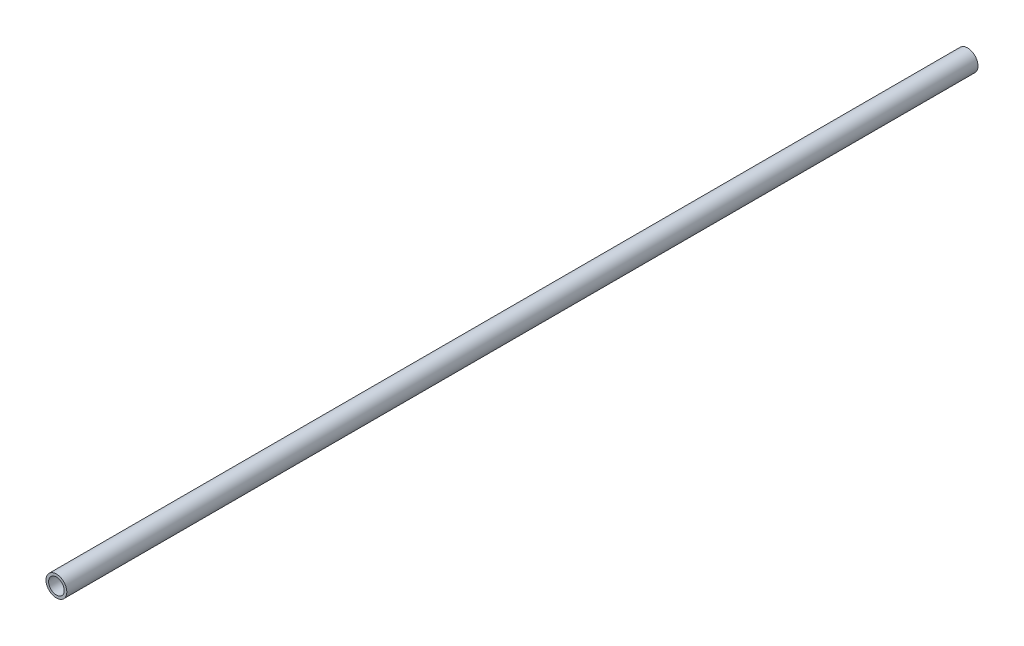
ISO-10303-21;
HEADER;
FILE_DESCRIPTION(('STEP AP214'),'2;1');
FILE_NAME('part.step','',(''),(''),'','','');
FILE_SCHEMA(('AUTOMOTIVE_DESIGN { 1 0 10303 214 1 1 1 1 }'));
ENDSEC;
DATA;
#1=APPLICATION_CONTEXT('core data for automotive mechanical design processes');
#2=APPLICATION_PROTOCOL_DEFINITION('international standard','automotive_design',2000,#1);
#3=PRODUCT_CONTEXT('',#1,'mechanical');
#4=PRODUCT('Part','Part','',(#3));
#5=PRODUCT_RELATED_PRODUCT_CATEGORY('part','',(#4));
#6=PRODUCT_DEFINITION_FORMATION('','',#4);
#7=PRODUCT_DEFINITION_CONTEXT('part definition',#1,'design');
#8=PRODUCT_DEFINITION('design','',#6,#7);
#9=PRODUCT_DEFINITION_SHAPE('','',#8);
#10=(LENGTH_UNIT() NAMED_UNIT(*) SI_UNIT(.MILLI.,.METRE.));
#11=(NAMED_UNIT(*) PLANE_ANGLE_UNIT() SI_UNIT($,.RADIAN.));
#12=(NAMED_UNIT(*) SI_UNIT($,.STERADIAN.) SOLID_ANGLE_UNIT());
#13=UNCERTAINTY_MEASURE_WITH_UNIT(LENGTH_MEASURE(1.E-05),#10,'distance_accuracy_value','');
#14=(GEOMETRIC_REPRESENTATION_CONTEXT(3) GLOBAL_UNCERTAINTY_ASSIGNED_CONTEXT((#13)) GLOBAL_UNIT_ASSIGNED_CONTEXT((#10,
#11,#12)) REPRESENTATION_CONTEXT('',''));
#15=CARTESIAN_POINT('',(0.,0.,0.));
#16=DIRECTION('',(0.,0.,1.));
#17=DIRECTION('',(1.,0.,0.));
#18=AXIS2_PLACEMENT_3D('',#15,#16,#17);
#19=CARTESIAN_POINT('',(0.,0.,350.));
#20=DIRECTION('',(0.,0.,1.));
#21=DIRECTION('',(1.,0.,0.));
#22=AXIS2_PLACEMENT_3D('',#19,#20,#21);
#23=PLANE('',#22);
#24=CARTESIAN_POINT('',(0.,0.,350.));
#25=DIRECTION('',(0.,0.,1.));
#26=DIRECTION('',(1.,0.,0.));
#27=AXIS2_PLACEMENT_3D('',#24,#25,#26);
#28=CIRCLE('',#27,4.);
#29=CARTESIAN_POINT('',(4.,0.,350.));
#30=VERTEX_POINT('',#29);
#31=EDGE_CURVE('E10',#30,#30,#28,.T.);
#32=ORIENTED_EDGE('',*,*,#31,.T.);
#33=EDGE_LOOP('',(#32));
#34=FACE_BOUND('',#33,.T.);
#35=CARTESIAN_POINT('',(0.,0.,350.));
#36=DIRECTION('',(0.,0.,1.));
#37=DIRECTION('',(1.,0.,0.));
#38=AXIS2_PLACEMENT_3D('',#35,#36,#37);
#39=CIRCLE('',#38,3.);
#40=CARTESIAN_POINT('',(3.,0.,350.));
#41=VERTEX_POINT('',#40);
#42=EDGE_CURVE('E44',#41,#41,#39,.T.);
#43=ORIENTED_EDGE('',*,*,#42,.F.);
#44=EDGE_LOOP('',(#43));
#45=FACE_BOUND('',#44,.T.);
#46=ADVANCED_FACE('F33',(#34,#45),#23,.T.);
#47=CARTESIAN_POINT('',(0.,0.,0.));
#48=DIRECTION('',(0.,0.,1.));
#49=DIRECTION('',(1.,0.,0.));
#50=AXIS2_PLACEMENT_3D('',#47,#48,#49);
#51=PLANE('',#50);
#52=CARTESIAN_POINT('',(0.,0.,0.));
#53=DIRECTION('',(0.,0.,1.));
#54=DIRECTION('',(1.,0.,0.));
#55=AXIS2_PLACEMENT_3D('',#52,#53,#54);
#56=CIRCLE('',#55,4.);
#57=CARTESIAN_POINT('',(4.,0.,0.));
#58=VERTEX_POINT('',#57);
#59=EDGE_CURVE('E37',#58,#58,#56,.T.);
#60=ORIENTED_EDGE('',*,*,#59,.F.);
#61=EDGE_LOOP('',(#60));
#62=FACE_BOUND('',#61,.T.);
#63=CARTESIAN_POINT('',(0.,0.,0.));
#64=DIRECTION('',(0.,0.,1.));
#65=DIRECTION('',(1.,0.,0.));
#66=AXIS2_PLACEMENT_3D('',#63,#64,#65);
#67=CIRCLE('',#66,3.);
#68=CARTESIAN_POINT('',(3.,0.,0.));
#69=VERTEX_POINT('',#68);
#70=EDGE_CURVE('E46',#69,#69,#67,.T.);
#71=ORIENTED_EDGE('',*,*,#70,.T.);
#72=EDGE_LOOP('',(#71));
#73=FACE_BOUND('',#72,.T.);
#74=ADVANCED_FACE('F56',(#62,#73),#51,.F.);
#75=CARTESIAN_POINT('',(0.,0.,350.));
#76=DIRECTION('',(0.,0.,-1.));
#77=DIRECTION('',(-1.,0.,0.));
#78=AXIS2_PLACEMENT_3D('',#75,#76,#77);
#79=CYLINDRICAL_SURFACE('',#78,4.);
#80=ORIENTED_EDGE('',*,*,#31,.F.);
#81=EDGE_LOOP('',(#80));
#82=FACE_BOUND('',#81,.T.);
#83=ORIENTED_EDGE('',*,*,#59,.T.);
#84=EDGE_LOOP('',(#83));
#85=FACE_BOUND('',#84,.T.);
#86=ADVANCED_FACE('F35',(#82,#85),#79,.T.);
#87=CARTESIAN_POINT('',(0.,0.,350.));
#88=DIRECTION('',(0.,0.,-1.));
#89=DIRECTION('',(-1.,0.,0.));
#90=AXIS2_PLACEMENT_3D('',#87,#88,#89);
#91=CYLINDRICAL_SURFACE('',#90,3.);
#92=ORIENTED_EDGE('',*,*,#42,.T.);
#93=EDGE_LOOP('',(#92));
#94=FACE_BOUND('',#93,.T.);
#95=ORIENTED_EDGE('',*,*,#70,.F.);
#96=EDGE_LOOP('',(#95));
#97=FACE_BOUND('',#96,.T.);
#98=ADVANCED_FACE('F52',(#94,#97),#91,.F.);
#99=CLOSED_SHELL('',(#46,#74,#86,#98));
#100=MANIFOLD_SOLID_BREP('B2',#99);
#101=ADVANCED_BREP_SHAPE_REPRESENTATION('',(#18,#100),#14);
#102=SHAPE_DEFINITION_REPRESENTATION(#9,#101);
ENDSEC;
END-ISO-10303-21;
